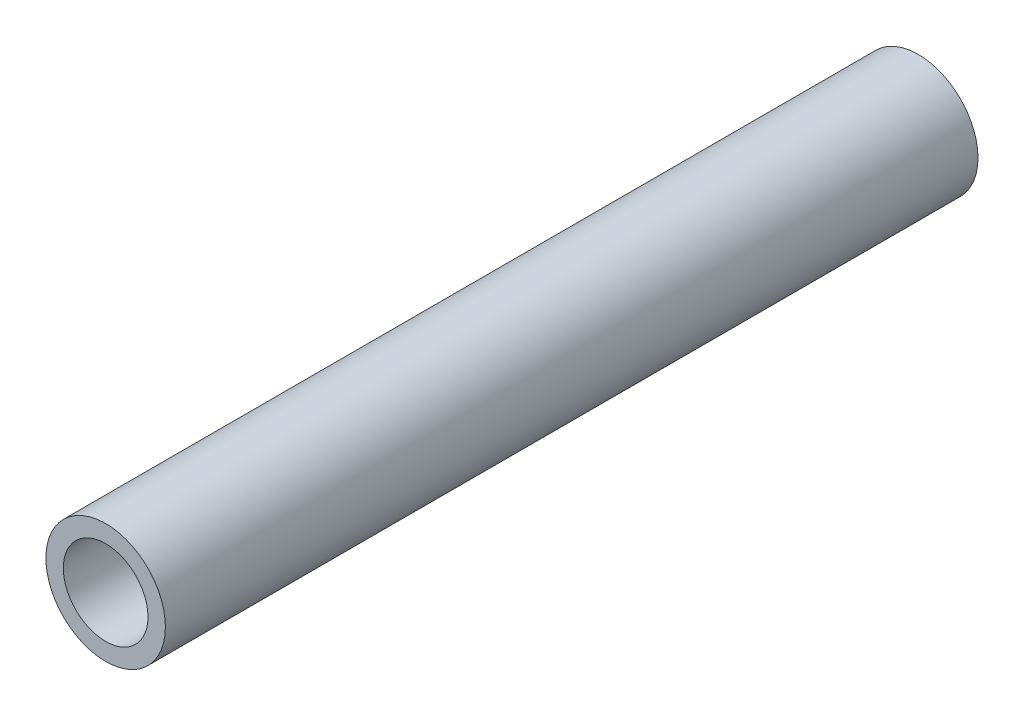
ISO-10303-21;
HEADER;
FILE_DESCRIPTION(('STEP AP214'),'2;1');
FILE_NAME('part.step','',(''),(''),'','','');
FILE_SCHEMA(('AUTOMOTIVE_DESIGN { 1 0 10303 214 1 1 1 1 }'));
ENDSEC;
DATA;
#1=APPLICATION_CONTEXT('core data for automotive mechanical design processes');
#2=APPLICATION_PROTOCOL_DEFINITION('international standard','automotive_design',2000,#1);
#3=PRODUCT_CONTEXT('',#1,'mechanical');
#4=PRODUCT('Part','Part','',(#3));
#5=PRODUCT_RELATED_PRODUCT_CATEGORY('part','',(#4));
#6=PRODUCT_DEFINITION_FORMATION('','',#4);
#7=PRODUCT_DEFINITION_CONTEXT('part definition',#1,'design');
#8=PRODUCT_DEFINITION('design','',#6,#7);
#9=PRODUCT_DEFINITION_SHAPE('','',#8);
#10=(LENGTH_UNIT() NAMED_UNIT(*) SI_UNIT(.MILLI.,.METRE.));
#11=(NAMED_UNIT(*) PLANE_ANGLE_UNIT() SI_UNIT($,.RADIAN.));
#12=(NAMED_UNIT(*) SI_UNIT($,.STERADIAN.) SOLID_ANGLE_UNIT());
#13=UNCERTAINTY_MEASURE_WITH_UNIT(LENGTH_MEASURE(1.E-05),#10,'distance_accuracy_value','');
#14=(GEOMETRIC_REPRESENTATION_CONTEXT(3) GLOBAL_UNCERTAINTY_ASSIGNED_CONTEXT((#13)) GLOBAL_UNIT_ASSIGNED_CONTEXT((#10,
#11,#12)) REPRESENTATION_CONTEXT('',''));
#15=CARTESIAN_POINT('',(0.,0.,0.));
#16=DIRECTION('',(0.,0.,1.));
#17=DIRECTION('',(1.,0.,0.));
#18=AXIS2_PLACEMENT_3D('',#15,#16,#17);
#19=CARTESIAN_POINT('',(455.85,22.346999888,-154.945));
#20=DIRECTION('',(0.,0.,1.));
#21=DIRECTION('',(1.,0.,0.));
#22=AXIS2_PLACEMENT_3D('',#19,#20,#21);
#23=PLANE('',#22);
#24=CARTESIAN_POINT('',(455.85,22.346999888,-154.945));
#25=DIRECTION('',(0.,0.,1.));
#26=DIRECTION('',(1.,0.,0.));
#27=AXIS2_PLACEMENT_3D('',#24,#25,#26);
#28=CIRCLE('',#27,3.17499999999997);
#29=CARTESIAN_POINT('',(459.025,22.346999888,-154.945));
#30=VERTEX_POINT('',#29);
#31=EDGE_CURVE('E10',#30,#30,#28,.T.);
#32=ORIENTED_EDGE('',*,*,#31,.T.);
#33=EDGE_LOOP('',(#32));
#34=FACE_BOUND('',#33,.T.);
#35=CARTESIAN_POINT('',(455.85,22.346999888,-154.945));
#36=DIRECTION('',(0.,0.,1.));
#37=DIRECTION('',(1.,0.,0.));
#38=AXIS2_PLACEMENT_3D('',#35,#36,#37);
#39=CIRCLE('',#38,2.25000000000001);
#40=CARTESIAN_POINT('',(458.1,22.346999888,-154.945));
#41=VERTEX_POINT('',#40);
#42=EDGE_CURVE('E54',#41,#41,#39,.T.);
#43=ORIENTED_EDGE('',*,*,#42,.F.);
#44=EDGE_LOOP('',(#43));
#45=FACE_BOUND('',#44,.T.);
#46=ADVANCED_FACE('F43',(#34,#45),#23,.T.);
#47=CARTESIAN_POINT('',(455.85,22.346999888,-198.12));
#48=DIRECTION('',(0.,0.,1.));
#49=DIRECTION('',(1.,0.,0.));
#50=AXIS2_PLACEMENT_3D('',#47,#48,#49);
#51=PLANE('',#50);
#52=CARTESIAN_POINT('',(455.85,22.346999888,-198.12));
#53=DIRECTION('',(0.,0.,1.));
#54=DIRECTION('',(1.,0.,0.));
#55=AXIS2_PLACEMENT_3D('',#52,#53,#54);
#56=CIRCLE('',#55,3.17499999999997);
#57=CARTESIAN_POINT('',(459.025,22.346999888,-198.12));
#58=VERTEX_POINT('',#57);
#59=EDGE_CURVE('E47',#58,#58,#56,.T.);
#60=ORIENTED_EDGE('',*,*,#59,.F.);
#61=EDGE_LOOP('',(#60));
#62=FACE_BOUND('',#61,.T.);
#63=CARTESIAN_POINT('',(455.85,22.346999888,-198.12));
#64=DIRECTION('',(0.,0.,1.));
#65=DIRECTION('',(1.,0.,0.));
#66=AXIS2_PLACEMENT_3D('',#63,#64,#65);
#67=CIRCLE('',#66,2.25000000000001);
#68=CARTESIAN_POINT('',(458.1,22.346999888,-198.12));
#69=VERTEX_POINT('',#68);
#70=EDGE_CURVE('E56',#69,#69,#67,.T.);
#71=ORIENTED_EDGE('',*,*,#70,.T.);
#72=EDGE_LOOP('',(#71));
#73=FACE_BOUND('',#72,.T.);
#74=ADVANCED_FACE('F66',(#62,#73),#51,.F.);
#75=CARTESIAN_POINT('',(455.85,22.346999888,-154.945));
#76=DIRECTION('',(0.,0.,-1.));
#77=DIRECTION('',(-1.,0.,0.));
#78=AXIS2_PLACEMENT_3D('',#75,#76,#77);
#79=CYLINDRICAL_SURFACE('',#78,3.17499999999997);
#80=ORIENTED_EDGE('',*,*,#31,.F.);
#81=EDGE_LOOP('',(#80));
#82=FACE_BOUND('',#81,.T.);
#83=ORIENTED_EDGE('',*,*,#59,.T.);
#84=EDGE_LOOP('',(#83));
#85=FACE_BOUND('',#84,.T.);
#86=ADVANCED_FACE('F45',(#82,#85),#79,.T.);
#87=CARTESIAN_POINT('',(455.85,22.346999888,-154.945));
#88=DIRECTION('',(0.,0.,-1.));
#89=DIRECTION('',(-1.,0.,0.));
#90=AXIS2_PLACEMENT_3D('',#87,#88,#89);
#91=CYLINDRICAL_SURFACE('',#90,2.25000000000001);
#92=ORIENTED_EDGE('',*,*,#42,.T.);
#93=EDGE_LOOP('',(#92));
#94=FACE_BOUND('',#93,.T.);
#95=ORIENTED_EDGE('',*,*,#70,.F.);
#96=EDGE_LOOP('',(#95));
#97=FACE_BOUND('',#96,.T.);
#98=ADVANCED_FACE('F62',(#94,#97),#91,.F.);
#99=CLOSED_SHELL('',(#46,#74,#86,#98));
#100=MANIFOLD_SOLID_BREP('B2',#99);
#101=ADVANCED_BREP_SHAPE_REPRESENTATION('',(#18,#100),#14);
#102=SHAPE_DEFINITION_REPRESENTATION(#9,#101);
ENDSEC;
END-ISO-10303-21;
